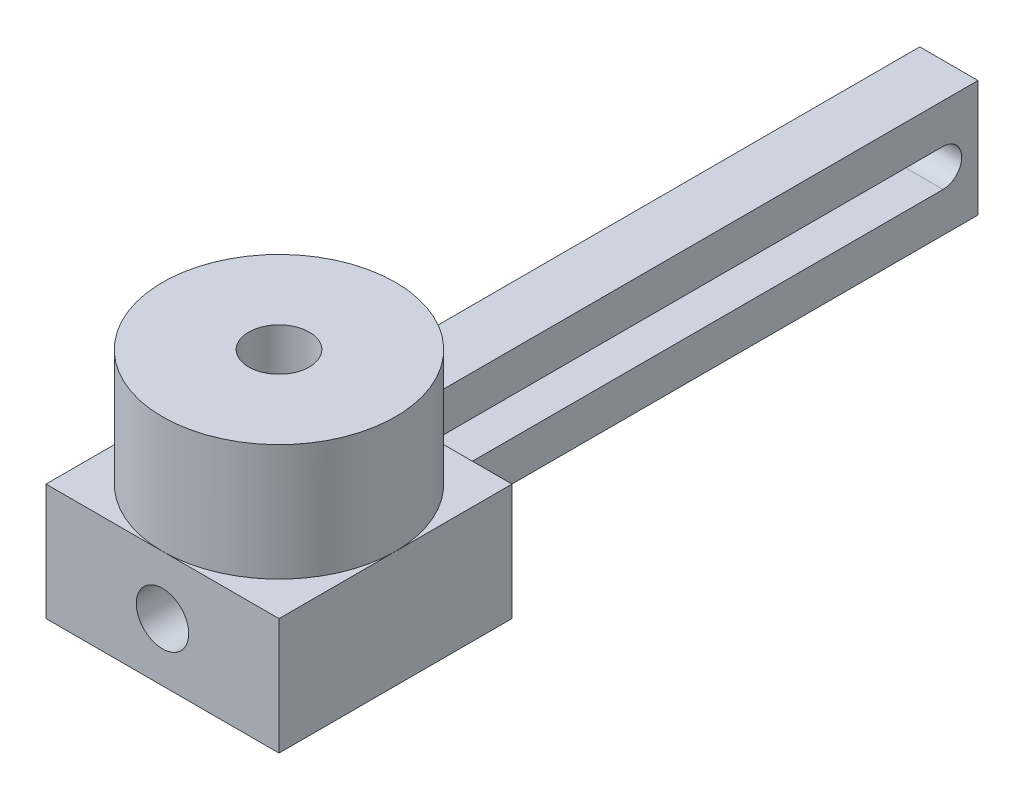
ISO-10303-21;
HEADER;
FILE_DESCRIPTION(('STEP AP214'),'2;1');
FILE_NAME('part.step','',(''),(''),'','','');
FILE_SCHEMA(('AUTOMOTIVE_DESIGN { 1 0 10303 214 1 1 1 1 }'));
ENDSEC;
DATA;
#1=APPLICATION_CONTEXT('core data for automotive mechanical design processes');
#2=APPLICATION_PROTOCOL_DEFINITION('international standard','automotive_design',2000,#1);
#3=PRODUCT_CONTEXT('',#1,'mechanical');
#4=PRODUCT('Part','Part','',(#3));
#5=PRODUCT_RELATED_PRODUCT_CATEGORY('part','',(#4));
#6=PRODUCT_DEFINITION_FORMATION('','',#4);
#7=PRODUCT_DEFINITION_CONTEXT('part definition',#1,'design');
#8=PRODUCT_DEFINITION('design','',#6,#7);
#9=PRODUCT_DEFINITION_SHAPE('','',#8);
#10=(LENGTH_UNIT() NAMED_UNIT(*) SI_UNIT(.MILLI.,.METRE.));
#11=(NAMED_UNIT(*) PLANE_ANGLE_UNIT() SI_UNIT($,.RADIAN.));
#12=(NAMED_UNIT(*) SI_UNIT($,.STERADIAN.) SOLID_ANGLE_UNIT());
#13=UNCERTAINTY_MEASURE_WITH_UNIT(LENGTH_MEASURE(1.E-05),#10,'distance_accuracy_value','');
#14=(GEOMETRIC_REPRESENTATION_CONTEXT(3) GLOBAL_UNCERTAINTY_ASSIGNED_CONTEXT((#13)) GLOBAL_UNIT_ASSIGNED_CONTEXT((#10,
#11,#12)) REPRESENTATION_CONTEXT('',''));
#15=CARTESIAN_POINT('',(0.,0.,0.));
#16=DIRECTION('',(0.,0.,1.));
#17=DIRECTION('',(1.,0.,0.));
#18=AXIS2_PLACEMENT_3D('',#15,#16,#17);
#19=CARTESIAN_POINT('',(-5.,10.,30.));
#20=DIRECTION('',(1.,0.,0.));
#21=DIRECTION('',(0.,0.,-1.));
#22=AXIS2_PLACEMENT_3D('',#19,#20,#21);
#23=PLANE('',#22);
#24=DIRECTION('',(0.,0.,1.));
#25=VECTOR('',#24,1.);
#26=CARTESIAN_POINT('',(-5.,3.4,-27.));
#27=LINE('',#26,#25);
#28=CARTESIAN_POINT('',(-5.,3.4,-27.));
#29=VERTEX_POINT('',#28);
#30=CARTESIAN_POINT('',(-5.,3.4,16.));
#31=VERTEX_POINT('',#30);
#32=EDGE_CURVE('E194',#29,#31,#27,.T.);
#33=ORIENTED_EDGE('',*,*,#32,.F.);
#34=CARTESIAN_POINT('',(-5.,5.,-27.));
#35=DIRECTION('',(-1.,0.,0.));
#36=DIRECTION('',(0.,0.,1.));
#37=AXIS2_PLACEMENT_3D('',#34,#35,#36);
#38=CIRCLE('',#37,1.6);
#39=CARTESIAN_POINT('',(-5.,6.6,-27.));
#40=VERTEX_POINT('',#39);
#41=EDGE_CURVE('E191',#40,#29,#38,.T.);
#42=ORIENTED_EDGE('',*,*,#41,.F.);
#43=DIRECTION('',(0.,0.,-1.));
#44=VECTOR('',#43,1.);
#45=CARTESIAN_POINT('',(-5.,6.6,-27.));
#46=LINE('',#45,#44);
#47=CARTESIAN_POINT('',(-5.,6.6,16.));
#48=VERTEX_POINT('',#47);
#49=EDGE_CURVE('E202',#48,#40,#46,.T.);
#50=ORIENTED_EDGE('',*,*,#49,.F.);
#51=CARTESIAN_POINT('',(-5.,5.,16.));
#52=DIRECTION('',(-1.,0.,0.));
#53=DIRECTION('',(0.,0.,1.));
#54=AXIS2_PLACEMENT_3D('',#51,#52,#53);
#55=CIRCLE('',#54,1.6);
#56=EDGE_CURVE('E198',#31,#48,#55,.T.);
#57=ORIENTED_EDGE('',*,*,#56,.F.);
#58=EDGE_LOOP('',(#33,#42,#50,#57));
#59=FACE_BOUND('',#58,.T.);
#60=DIRECTION('',(0.,-1.,0.));
#61=VECTOR('',#60,1.);
#62=CARTESIAN_POINT('',(-5.,10.,20.));
#63=LINE('',#62,#61);
#64=CARTESIAN_POINT('',(-5.,10.,20.));
#65=VERTEX_POINT('',#64);
#66=CARTESIAN_POINT('',(-5.,0.,20.));
#67=VERTEX_POINT('',#66);
#68=EDGE_CURVE('E63',#65,#67,#63,.T.);
#69=ORIENTED_EDGE('',*,*,#68,.F.);
#70=DIRECTION('',(0.,0.,1.));
#71=VECTOR('',#70,1.);
#72=CARTESIAN_POINT('',(-5.,10.,30.));
#73=LINE('',#72,#71);
#74=CARTESIAN_POINT('',(-5.,10.,-30.));
#75=VERTEX_POINT('',#74);
#76=EDGE_CURVE('E256',#75,#65,#73,.T.);
#77=ORIENTED_EDGE('',*,*,#76,.F.);
#78=DIRECTION('',(0.,-1.,0.));
#79=VECTOR('',#78,1.);
#80=CARTESIAN_POINT('',(-5.,10.,-30.));
#81=LINE('',#80,#79);
#82=CARTESIAN_POINT('',(-5.,0.,-30.));
#83=VERTEX_POINT('',#82);
#84=EDGE_CURVE('E259',#75,#83,#81,.T.);
#85=ORIENTED_EDGE('',*,*,#84,.T.);
#86=DIRECTION('',(0.,0.,1.));
#87=VECTOR('',#86,1.);
#88=CARTESIAN_POINT('',(-5.,0.,30.));
#89=LINE('',#88,#87);
#90=EDGE_CURVE('E68',#83,#67,#89,.T.);
#91=ORIENTED_EDGE('',*,*,#90,.T.);
#92=EDGE_LOOP('',(#69,#77,#85,#91));
#93=FACE_BOUND('',#92,.T.);
#94=ADVANCED_FACE('F47',(#59,#93),#23,.F.);
#95=CARTESIAN_POINT('',(0.,20.,30.));
#96=DIRECTION('',(0.,-1.,0.));
#97=DIRECTION('',(0.,0.,-1.));
#98=AXIS2_PLACEMENT_3D('',#95,#96,#97);
#99=CYLINDRICAL_SURFACE('',#98,10.);
#100=CARTESIAN_POINT('',(0.,20.,30.));
#101=DIRECTION('',(0.,1.,0.));
#102=DIRECTION('',(0.,0.,1.));
#103=AXIS2_PLACEMENT_3D('',#100,#101,#102);
#104=CIRCLE('',#103,10.);
#105=CARTESIAN_POINT('',(0.,20.,40.));
#106=VERTEX_POINT('',#105);
#107=EDGE_CURVE('E243',#106,#106,#104,.T.);
#108=ORIENTED_EDGE('',*,*,#107,.F.);
#109=EDGE_LOOP('',(#108));
#110=FACE_BOUND('',#109,.T.);
#111=CARTESIAN_POINT('',(0.,10.,30.));
#112=DIRECTION('',(0.,-1.,0.));
#113=DIRECTION('',(0.,0.,-1.));
#114=AXIS2_PLACEMENT_3D('',#111,#112,#113);
#115=CIRCLE('',#114,10.);
#116=CARTESIAN_POINT('',(10.,10.,30.));
#117=VERTEX_POINT('',#116);
#118=CARTESIAN_POINT('',(0.,10.,40.));
#119=VERTEX_POINT('',#118);
#120=EDGE_CURVE('E153',#117,#119,#115,.T.);
#121=ORIENTED_EDGE('',*,*,#120,.F.);
#122=CARTESIAN_POINT('',(0.,10.,30.));
#123=DIRECTION('',(0.,-1.,0.));
#124=DIRECTION('',(0.,0.,-1.));
#125=AXIS2_PLACEMENT_3D('',#122,#123,#124);
#126=CIRCLE('',#125,10.);
#127=CARTESIAN_POINT('',(0.,10.,20.));
#128=VERTEX_POINT('',#127);
#129=EDGE_CURVE('E248',#117,#128,#126,.F.);
#130=ORIENTED_EDGE('',*,*,#129,.T.);
#131=CARTESIAN_POINT('',(-10.,10.,30.));
#132=VERTEX_POINT('',#131);
#133=EDGE_CURVE('E247',#128,#132,#126,.F.);
#134=ORIENTED_EDGE('',*,*,#133,.T.);
#135=EDGE_CURVE('E182',#119,#132,#115,.T.);
#136=ORIENTED_EDGE('',*,*,#135,.F.);
#137=EDGE_LOOP('',(#121,#130,#134,#136));
#138=FACE_BOUND('',#137,.T.);
#139=ADVANCED_FACE('F306',(#110,#138),#99,.T.);
#140=CARTESIAN_POINT('',(0.,20.,30.));
#141=DIRECTION('',(0.,-1.,0.));
#142=DIRECTION('',(0.,0.,-1.));
#143=AXIS2_PLACEMENT_3D('',#140,#141,#142);
#144=CYLINDRICAL_SURFACE('',#143,2.6);
#145=CARTESIAN_POINT('',(2.25,5.,31.3028814220795));
#146=CARTESIAN_POINT('',(2.24999330145076,4.9258640802187,31.302900991512));
#147=CARTESIAN_POINT('',(2.24628899919312,4.85166665550486,31.3093535328206));
#148=CARTESIAN_POINT('',(2.23190199793571,4.70583402487835,31.3337138651166));
#149=CARTESIAN_POINT('',(2.22119898721934,4.63420691880781,31.3516549952422));
#150=CARTESIAN_POINT('',(2.18780906243965,4.46490921219136,31.4052918080339));
#151=CARTESIAN_POINT('',(2.1619476903597,4.36928845011578,31.4453049395887));
#152=CARTESIAN_POINT('',(2.09977706074741,4.18582314069619,31.5342423838016));
#153=CARTESIAN_POINT('',(2.06342838808052,4.09800959557704,31.5832000538734));
#154=CARTESIAN_POINT('',(1.99040791068232,3.94831050025853,31.6735800413865));
#155=CARTESIAN_POINT('',(1.9556288360965,3.88502040171271,31.7142367960842));
#156=CARTESIAN_POINT('',(1.88045299587418,3.76243285313603,31.796386538532));
#157=CARTESIAN_POINT('',(1.8400533508249,3.70313747285299,31.8378799455223));
#158=CARTESIAN_POINT('',(1.71054659546221,3.53129265691205,31.9616914290919));
#159=CARTESIAN_POINT('',(1.612991028934,3.42449777534571,32.0435257603755));
#160=CARTESIAN_POINT('',(1.41995919820945,3.25099845104683,32.1804645779456));
#161=CARTESIAN_POINT('',(1.32901194656057,3.18069138922072,32.2374262778764));
#162=CARTESIAN_POINT('',(1.13378784414384,3.05306149404458,32.3423791100754));
#163=CARTESIAN_POINT('',(1.02953374778608,2.99571694840681,32.3903852190796));
#164=CARTESIAN_POINT('',(0.829306545124255,2.90608760038453,32.4660721897017));
#165=CARTESIAN_POINT('',(0.735334978052761,2.87113384047658,32.4958672132049));
#166=CARTESIAN_POINT('',(0.541033533345685,2.8136739911043,32.5450536801225));
#167=CARTESIAN_POINT('',(0.440707465562096,2.7911605203271,32.5644512925246));
#168=CARTESIAN_POINT('',(0.235801630222388,2.75998169106086,32.5913547180046));
#169=CARTESIAN_POINT('',(0.13120322830646,2.75138559117428,32.5988010550032));
#170=CARTESIAN_POINT('',(-0.0782949057318882,2.74892545165571,32.6009297756695));
#171=CARTESIAN_POINT('',(-0.183194591876143,2.75505927223199,32.5956140132667));
#172=CARTESIAN_POINT('',(-0.381388303078068,2.78049075640434,32.573652173815));
#173=CARTESIAN_POINT('',(-0.474935702893244,2.79868603466576,32.5579551725509));
#174=CARTESIAN_POINT('',(-0.657083269572316,2.84602602438182,32.5173313266297));
#175=CARTESIAN_POINT('',(-0.745682586235334,2.87517261092911,32.4924029013706));
#176=CARTESIAN_POINT('',(-0.922620336570302,2.94549602958515,32.4327172511744));
#177=CARTESIAN_POINT('',(-1.0104724589549,2.98739286179203,32.3973776648439));
#178=CARTESIAN_POINT('',(-1.17775019547865,3.08047264962098,32.3197911520005));
#179=CARTESIAN_POINT('',(-1.257170167629,3.13166176145835,32.2775396481276));
#180=CARTESIAN_POINT('',(-1.44553451745539,3.27005388081044,32.1651337632809));
#181=CARTESIAN_POINT('',(-1.54888644405977,3.36231196363321,32.0917363958118));
#182=CARTESIAN_POINT('',(-1.68881646267614,3.5116862874541,31.9777640306926));
#183=CARTESIAN_POINT('',(-1.73300807052692,3.56340998748579,31.9390554232234));
#184=CARTESIAN_POINT('',(-1.81638680382284,3.67040201623991,31.8611808887389));
#185=CARTESIAN_POINT('',(-1.85557535817154,3.7256693260803,31.8220150958023));
#186=CARTESIAN_POINT('',(-1.95249631882825,3.87630899853231,31.719132002326));
#187=CARTESIAN_POINT('',(-2.00603860241903,3.97470475124525,31.6557493503667));
#188=CARTESIAN_POINT('',(-2.0757414040047,4.12994824203131,31.5661245868573));
#189=CARTESIAN_POINT('',(-2.0971913518885,4.18291526752366,31.537183635344));
#190=CARTESIAN_POINT('',(-2.13637340734276,4.29165711098877,31.4822417151527));
#191=CARTESIAN_POINT('',(-2.15410830169322,4.3474297851244,31.4562385495423));
#192=CARTESIAN_POINT('',(-2.18770720427863,4.46990173878021,31.4053438278301));
#193=CARTESIAN_POINT('',(-2.20297449691695,4.53704623289754,31.3811018459721));
#194=CARTESIAN_POINT('',(-2.22747426429568,4.67483964071041,31.3412360696769));
#195=CARTESIAN_POINT('',(-2.23672228084305,4.7454790184636,31.3255900967272));
#196=CARTESIAN_POINT('',(-2.24847605834555,4.88983479342612,31.3055686360162));
#197=CARTESIAN_POINT('',(-2.25090355868052,4.9635771298608,31.3013239946238));
#198=CARTESIAN_POINT('',(-2.24848517014633,5.11059212613225,31.3054941925056));
#199=CARTESIAN_POINT('',(-2.24363494158503,5.18386447954921,31.3139165851085));
#200=CARTESIAN_POINT('',(-2.22594418794106,5.3386241774601,31.3436882640333));
#201=CARTESIAN_POINT('',(-2.21197697196194,5.41961387854789,31.3668463794876));
#202=CARTESIAN_POINT('',(-2.17638781845319,5.57650597708427,31.4228228425471));
#203=CARTESIAN_POINT('',(-2.15473768749295,5.65238839593493,31.4556766941001));
#204=CARTESIAN_POINT('',(-2.10842428953527,5.7882989140396,31.5218202666096));
#205=CARTESIAN_POINT('',(-2.08466351111483,5.84902350658826,31.5543448812235));
#206=CARTESIAN_POINT('',(-2.03258858877001,5.96708088162643,31.6218533448842));
#207=CARTESIAN_POINT('',(-2.00427133226337,6.02441130863812,31.6568388657429));
#208=CARTESIAN_POINT('',(-1.91268474165804,6.19178937437806,31.7636311946083));
#209=CARTESIAN_POINT('',(-1.84280671714632,6.29714918030954,31.8372338303761));
#210=CARTESIAN_POINT('',(-1.68085933916187,6.50175002599741,31.9868778533615));
#211=CARTESIAN_POINT('',(-1.58768606993855,6.60021141722907,32.0627891572802));
#212=CARTESIAN_POINT('',(-1.38154063735695,6.78116304304481,32.2061326156968));
#213=CARTESIAN_POINT('',(-1.26862098866731,6.86369444769498,32.2735864652722));
#214=CARTESIAN_POINT('',(-1.05860241987063,6.98801671529506,32.3767395471279));
#215=CARTESIAN_POINT('',(-0.966165898533776,7.03471509614192,32.4160099880405));
#216=CARTESIAN_POINT('',(-0.772566413003492,7.11580414614525,32.4846848591754));
#217=CARTESIAN_POINT('',(-0.671409151002115,7.15020278305517,32.5140956756719));
#218=CARTESIAN_POINT('',(-0.461717791439902,7.20479707940461,32.5609436138678));
#219=CARTESIAN_POINT('',(-0.353132962894019,7.22488152128765,32.5782869502783));
#220=CARTESIAN_POINT('',(-0.132881580363164,7.24879592591336,32.5989507210698));
#221=CARTESIAN_POINT('',(-0.0212171320132093,7.2526367305912,32.6022805088896));
#222=CARTESIAN_POINT('',(0.187649248540151,7.24430320402878,32.5950714979961));
#223=CARTESIAN_POINT('',(0.284990460031568,7.23398088232947,32.5861364257693));
#224=CARTESIAN_POINT('',(0.476026283556189,7.20120271215055,32.5578749969421));
#225=CARTESIAN_POINT('',(0.569720449163928,7.17874538323187,32.5385473724789));
#226=CARTESIAN_POINT('',(0.752531391952896,7.12260927741629,32.4905332472295));
#227=CARTESIAN_POINT('',(0.84157136283304,7.08878620068853,32.4617265022575));
#228=CARTESIAN_POINT('',(1.01237970725114,7.01156322846355,32.3965515302745));
#229=CARTESIAN_POINT('',(1.09414512780422,6.9681594685069,32.3601802523803));
#230=CARTESIAN_POINT('',(1.28627967955924,6.85092555984832,32.263156779711));
#231=CARTESIAN_POINT('',(1.39206445535752,6.77237562844299,32.1991200221702));
#232=CARTESIAN_POINT('',(1.5861768266682,6.60106168333753,32.0635175424234));
#233=CARTESIAN_POINT('',(1.67445261239869,6.50825688536808,31.9919304082256));
#234=CARTESIAN_POINT('',(1.79450950990334,6.35882989675406,31.8822231316237));
#235=CARTESIAN_POINT('',(1.832795319716,6.30672902861856,31.8448710467607));
#236=CARTESIAN_POINT('',(1.90481602765919,6.19931594624029,31.7704106051414));
#237=CARTESIAN_POINT('',(1.93855246063371,6.1440048241092,31.7333021702237));
#238=CARTESIAN_POINT('',(2.00138270448196,6.03014119189817,31.660355282121));
#239=CARTESIAN_POINT('',(2.03048321867079,5.97159352989884,31.6245150546302));
#240=CARTESIAN_POINT('',(2.08391416827877,5.85096899406763,31.5553802524678));
#241=CARTESIAN_POINT('',(2.10824851001542,5.78889506462758,31.5220836068661));
#242=CARTESIAN_POINT('',(2.15366898476491,5.65543628855317,31.4571895448017));
#243=CARTESIAN_POINT('',(2.17430773896313,5.58370775765185,31.4259726155472));
#244=CARTESIAN_POINT('',(2.20872125366922,5.43563376734781,31.3720725524195));
#245=CARTESIAN_POINT('',(2.22252047932126,5.35930587549504,31.3493590739302));
#246=CARTESIAN_POINT('',(2.23815441225325,5.23519107112605,31.3231754522153));
#247=CARTESIAN_POINT('',(2.24257593172129,5.18858809744862,31.3156327405979));
#248=CARTESIAN_POINT('',(2.24850051878828,5.0946649955423,31.305480061126));
#249=CARTESIAN_POINT('',(2.25000427785994,5.04734503990885,31.3028689245539));
#250=CARTESIAN_POINT('',(2.25,5.,31.3028814220795));
#251=B_SPLINE_CURVE_WITH_KNOTS('',3,(#145,#146,#147,#148,#149,#150,#151,#152,#153,#154,#155,
#156,#157,#158,#159,#160,#161,#162,#163,#164,#165,#166,#167,#168,#169,#170,#171,#172,#173,#174,
#175,#176,#177,#178,#179,#180,#181,#182,#183,#184,#185,#186,#187,#188,#189,#190,#191,#192,#193,
#194,#195,#196,#197,#198,#199,#200,#201,#202,#203,#204,#205,#206,#207,#208,#209,#210,#211,#212,
#213,#214,#215,#216,#217,#218,#219,#220,#221,#222,#223,#224,#225,#226,#227,#228,#229,#230,#231,
#232,#233,#234,#235,#236,#237,#238,#239,#240,#241,#242,#243,#244,#245,#246,#247,#248,#249,#250),
.UNSPECIFIED.,.T.,.F.,(4,2,2,2,2,2,2,2,2,2,2,2,2,2,2,2,2,2,2,2,2,2,2,2,2,2,2,2,2,2,2,2,2,2,2,2,
2,2,2,2,2,2,2,2,2,2,2,2,2,2,2,2,4),(0.,0.222194483433209,0.445036701039096,0.763730453352175,
1.0836379344537,1.33195325285354,1.58039625461989,2.0761874328192,2.4597389697845,
2.84264321501054,3.15514892155454,3.46746900652091,3.78133860080087,4.09516260251075,
4.38365841849669,4.67220365351738,4.98170574443689,5.29141363651091,5.7590290098714,
5.99366645174007,6.22823672904278,6.61298061111761,6.80497566206601,6.996826171552,
7.21517444551572,7.43295668259977,7.65322780837113,7.87363033348996,8.12835576804483,
8.38402578395061,8.60233850114488,8.82080098836089,9.25798883063243,9.72217464897674,
10.1851442550035,10.5161731699684,10.8469872547906,11.1803444569092,11.5134791221605,
11.8069575699553,12.1004718294372,12.397862953824,12.6953742536579,13.13250672272,
13.570913994625,13.7947551676366,14.0185206323808,14.2419595473039,14.4652145600154,
14.7073088879061,14.9485308742559,15.0904634310384,15.2323623474706),.UNSPECIFIED.);
#252=CARTESIAN_POINT('',(2.25,5.,31.3028814220795));
#253=VERTEX_POINT('',#252);
#254=EDGE_CURVE('E333',#253,#253,#251,.T.);
#255=ORIENTED_EDGE('',*,*,#254,.F.);
#256=EDGE_LOOP('',(#255));
#257=FACE_BOUND('',#256,.T.);
#258=CARTESIAN_POINT('',(0.,20.,30.));
#259=DIRECTION('',(0.,1.,0.));
#260=DIRECTION('',(0.,0.,1.));
#261=AXIS2_PLACEMENT_3D('',#258,#259,#260);
#262=CIRCLE('',#261,2.6);
#263=CARTESIAN_POINT('',(0.,20.,32.6));
#264=VERTEX_POINT('',#263);
#265=EDGE_CURVE('E237',#264,#264,#262,.T.);
#266=ORIENTED_EDGE('',*,*,#265,.T.);
#267=EDGE_LOOP('',(#266));
#268=FACE_BOUND('',#267,.T.);
#269=CARTESIAN_POINT('',(0.,0.,30.));
#270=DIRECTION('',(0.,-1.,0.));
#271=DIRECTION('',(0.,0.,-1.));
#272=AXIS2_PLACEMENT_3D('',#269,#270,#271);
#273=CIRCLE('',#272,2.6);
#274=CARTESIAN_POINT('',(0.,0.,27.4));
#275=VERTEX_POINT('',#274);
#276=EDGE_CURVE('E342',#275,#275,#273,.T.);
#277=ORIENTED_EDGE('',*,*,#276,.T.);
#278=EDGE_LOOP('',(#277));
#279=FACE_BOUND('',#278,.T.);
#280=ADVANCED_FACE('F309',(#257,#268,#279),#144,.F.);
#281=CARTESIAN_POINT('',(0.,10.,0.));
#282=DIRECTION('',(0.,-1.,0.));
#283=DIRECTION('',(0.,0.,-1.));
#284=AXIS2_PLACEMENT_3D('',#281,#282,#283);
#285=PLANE('',#284);
#286=ORIENTED_EDGE('',*,*,#133,.F.);
#287=DIRECTION('',(0.,0.,1.));
#288=VECTOR('',#287,1.);
#289=CARTESIAN_POINT('',(0.,10.,-30.));
#290=LINE('',#289,#288);
#291=CARTESIAN_POINT('',(0.,10.,-30.));
#292=VERTEX_POINT('',#291);
#293=EDGE_CURVE('E210',#292,#128,#290,.T.);
#294=ORIENTED_EDGE('',*,*,#293,.F.);
#295=DIRECTION('',(-1.,0.,0.));
#296=VECTOR('',#295,1.);
#297=CARTESIAN_POINT('',(-5.,10.,-30.));
#298=LINE('',#297,#296);
#299=EDGE_CURVE('E253',#292,#75,#298,.T.);
#300=ORIENTED_EDGE('',*,*,#299,.T.);
#301=ORIENTED_EDGE('',*,*,#76,.T.);
#302=DIRECTION('',(-1.,0.,0.));
#303=VECTOR('',#302,1.);
#304=CARTESIAN_POINT('',(-10.,10.,20.));
#305=LINE('',#304,#303);
#306=CARTESIAN_POINT('',(-10.,10.,20.));
#307=VERTEX_POINT('',#306);
#308=EDGE_CURVE('E387',#65,#307,#305,.T.);
#309=ORIENTED_EDGE('',*,*,#308,.T.);
#310=DIRECTION('',(0.,0.,-1.));
#311=VECTOR('',#310,1.);
#312=CARTESIAN_POINT('',(-10.,10.,40.));
#313=LINE('',#312,#311);
#314=EDGE_CURVE('E406',#132,#307,#313,.T.);
#315=ORIENTED_EDGE('',*,*,#314,.F.);
#316=EDGE_LOOP('',(#286,#294,#300,#301,#309,#315));
#317=FACE_BOUND('',#316,.T.);
#318=ADVANCED_FACE('F321',(#317),#285,.F.);
#319=CARTESIAN_POINT('',(-5.,10.,-30.));
#320=DIRECTION('',(0.,0.,1.));
#321=DIRECTION('',(1.,0.,0.));
#322=AXIS2_PLACEMENT_3D('',#319,#320,#321);
#323=PLANE('',#322);
#324=ORIENTED_EDGE('',*,*,#299,.F.);
#325=DIRECTION('',(0.,1.,0.));
#326=VECTOR('',#325,1.);
#327=CARTESIAN_POINT('',(0.,0.,-30.));
#328=LINE('',#327,#326);
#329=CARTESIAN_POINT('',(0.,0.,-30.));
#330=VERTEX_POINT('',#329);
#331=EDGE_CURVE('E234',#330,#292,#328,.T.);
#332=ORIENTED_EDGE('',*,*,#331,.F.);
#333=DIRECTION('',(-1.,0.,0.));
#334=VECTOR('',#333,1.);
#335=CARTESIAN_POINT('',(-5.,0.,-30.));
#336=LINE('',#335,#334);
#337=EDGE_CURVE('E252',#330,#83,#336,.T.);
#338=ORIENTED_EDGE('',*,*,#337,.T.);
#339=ORIENTED_EDGE('',*,*,#84,.F.);
#340=EDGE_LOOP('',(#324,#332,#338,#339));
#341=FACE_BOUND('',#340,.T.);
#342=ADVANCED_FACE('F49',(#341),#323,.F.);
#343=ORIENTED_EDGE('',*,*,#129,.F.);
#344=DIRECTION('',(0.,0.,-1.));
#345=VECTOR('',#344,1.);
#346=CARTESIAN_POINT('',(10.,10.,40.));
#347=LINE('',#346,#345);
#348=CARTESIAN_POINT('',(10.,10.,20.));
#349=VERTEX_POINT('',#348);
#350=EDGE_CURVE('E176',#117,#349,#347,.T.);
#351=ORIENTED_EDGE('',*,*,#350,.T.);
#352=DIRECTION('',(1.,0.,0.));
#353=VECTOR('',#352,1.);
#354=CARTESIAN_POINT('',(0.,10.,20.));
#355=LINE('',#354,#353);
#356=EDGE_CURVE('E225',#128,#349,#355,.T.);
#357=ORIENTED_EDGE('',*,*,#356,.F.);
#358=EDGE_LOOP('',(#343,#351,#357));
#359=FACE_BOUND('',#358,.T.);
#360=ADVANCED_FACE('F317',(#359),#285,.F.);
#361=CARTESIAN_POINT('',(0.,0.,0.));
#362=DIRECTION('',(0.,-1.,0.));
#363=DIRECTION('',(0.,0.,-1.));
#364=AXIS2_PLACEMENT_3D('',#361,#362,#363);
#365=PLANE('',#364);
#366=ORIENTED_EDGE('',*,*,#276,.F.);
#367=EDGE_LOOP('',(#366));
#368=FACE_BOUND('',#367,.T.);
#369=DIRECTION('',(1.,0.,0.));
#370=VECTOR('',#369,1.);
#371=CARTESIAN_POINT('',(0.,0.,20.));
#372=LINE('',#371,#370);
#373=CARTESIAN_POINT('',(0.,0.,20.));
#374=VERTEX_POINT('',#373);
#375=CARTESIAN_POINT('',(10.,0.,20.));
#376=VERTEX_POINT('',#375);
#377=EDGE_CURVE('E224',#374,#376,#372,.T.);
#378=ORIENTED_EDGE('',*,*,#377,.T.);
#379=DIRECTION('',(0.,0.,-1.));
#380=VECTOR('',#379,1.);
#381=CARTESIAN_POINT('',(10.,0.,40.));
#382=LINE('',#381,#380);
#383=CARTESIAN_POINT('',(10.,0.,40.));
#384=VERTEX_POINT('',#383);
#385=EDGE_CURVE('E386',#384,#376,#382,.T.);
#386=ORIENTED_EDGE('',*,*,#385,.F.);
#387=DIRECTION('',(1.,0.,0.));
#388=VECTOR('',#387,1.);
#389=CARTESIAN_POINT('',(-10.,0.,40.));
#390=LINE('',#389,#388);
#391=CARTESIAN_POINT('',(-10.,0.,40.));
#392=VERTEX_POINT('',#391);
#393=EDGE_CURVE('E166',#392,#384,#390,.T.);
#394=ORIENTED_EDGE('',*,*,#393,.F.);
#395=DIRECTION('',(0.,0.,-1.));
#396=VECTOR('',#395,1.);
#397=CARTESIAN_POINT('',(-10.,0.,40.));
#398=LINE('',#397,#396);
#399=CARTESIAN_POINT('',(-10.,0.,20.));
#400=VERTEX_POINT('',#399);
#401=EDGE_CURVE('E404',#392,#400,#398,.T.);
#402=ORIENTED_EDGE('',*,*,#401,.T.);
#403=DIRECTION('',(1.,0.,0.));
#404=VECTOR('',#403,1.);
#405=CARTESIAN_POINT('',(-10.,0.,20.));
#406=LINE('',#405,#404);
#407=EDGE_CURVE('E170',#400,#67,#406,.T.);
#408=ORIENTED_EDGE('',*,*,#407,.T.);
#409=ORIENTED_EDGE('',*,*,#90,.F.);
#410=ORIENTED_EDGE('',*,*,#337,.F.);
#411=DIRECTION('',(0.,0.,1.));
#412=VECTOR('',#411,1.);
#413=CARTESIAN_POINT('',(0.,0.,-30.));
#414=LINE('',#413,#412);
#415=EDGE_CURVE('E220',#330,#374,#414,.T.);
#416=ORIENTED_EDGE('',*,*,#415,.T.);
#417=EDGE_LOOP('',(#378,#386,#394,#402,#408,#409,#410,#416));
#418=FACE_BOUND('',#417,.T.);
#419=ADVANCED_FACE('F313',(#368,#418),#365,.T.);
#420=CARTESIAN_POINT('',(0.,20.,30.));
#421=DIRECTION('',(0.,1.,0.));
#422=DIRECTION('',(0.,0.,1.));
#423=AXIS2_PLACEMENT_3D('',#420,#421,#422);
#424=PLANE('',#423);
#425=ORIENTED_EDGE('',*,*,#107,.T.);
#426=EDGE_LOOP('',(#425));
#427=FACE_BOUND('',#426,.T.);
#428=ORIENTED_EDGE('',*,*,#265,.F.);
#429=EDGE_LOOP('',(#428));
#430=FACE_BOUND('',#429,.T.);
#431=ADVANCED_FACE('F316',(#427,#430),#424,.T.);
#432=CARTESIAN_POINT('',(0.,0.,20.));
#433=DIRECTION('',(0.,0.,1.));
#434=DIRECTION('',(1.,0.,0.));
#435=AXIS2_PLACEMENT_3D('',#432,#433,#434);
#436=PLANE('',#435);
#437=ORIENTED_EDGE('',*,*,#377,.F.);
#438=DIRECTION('',(0.,1.,0.));
#439=VECTOR('',#438,1.);
#440=CARTESIAN_POINT('',(0.,0.,20.));
#441=LINE('',#440,#439);
#442=EDGE_CURVE('E228',#374,#128,#441,.T.);
#443=ORIENTED_EDGE('',*,*,#442,.T.);
#444=ORIENTED_EDGE('',*,*,#356,.T.);
#445=DIRECTION('',(0.,1.,0.));
#446=VECTOR('',#445,1.);
#447=CARTESIAN_POINT('',(10.,10.,20.));
#448=LINE('',#447,#446);
#449=EDGE_CURVE('E372',#376,#349,#448,.T.);
#450=ORIENTED_EDGE('',*,*,#449,.F.);
#451=EDGE_LOOP('',(#437,#443,#444,#450));
#452=FACE_BOUND('',#451,.T.);
#453=ADVANCED_FACE('F325',(#452),#436,.F.);
#454=CARTESIAN_POINT('',(0.,0.,-30.));
#455=DIRECTION('',(-1.,0.,0.));
#456=DIRECTION('',(0.,0.,1.));
#457=AXIS2_PLACEMENT_3D('',#454,#455,#456);
#458=PLANE('',#457);
#459=DIRECTION('',(0.,0.,-1.));
#460=VECTOR('',#459,1.);
#461=CARTESIAN_POINT('',(0.,6.6,-30.));
#462=LINE('',#461,#460);
#463=CARTESIAN_POINT('',(0.,6.6,16.));
#464=VERTEX_POINT('',#463);
#465=CARTESIAN_POINT('',(0.,6.6,-27.));
#466=VERTEX_POINT('',#465);
#467=EDGE_CURVE('E56',#464,#466,#462,.T.);
#468=ORIENTED_EDGE('',*,*,#467,.T.);
#469=CARTESIAN_POINT('',(0.,5.,-27.));
#470=DIRECTION('',(-1.,0.,0.));
#471=DIRECTION('',(0.,0.,1.));
#472=AXIS2_PLACEMENT_3D('',#469,#470,#471);
#473=CIRCLE('',#472,1.6);
#474=CARTESIAN_POINT('',(0.,3.4,-27.));
#475=VERTEX_POINT('',#474);
#476=EDGE_CURVE('E11',#466,#475,#473,.T.);
#477=ORIENTED_EDGE('',*,*,#476,.T.);
#478=DIRECTION('',(0.,0.,1.));
#479=VECTOR('',#478,1.);
#480=CARTESIAN_POINT('',(0.,3.4,-30.));
#481=LINE('',#480,#479);
#482=CARTESIAN_POINT('',(0.,3.4,16.));
#483=VERTEX_POINT('',#482);
#484=EDGE_CURVE('E266',#475,#483,#481,.T.);
#485=ORIENTED_EDGE('',*,*,#484,.T.);
#486=CARTESIAN_POINT('',(0.,5.,16.));
#487=DIRECTION('',(-1.,0.,0.));
#488=DIRECTION('',(0.,0.,1.));
#489=AXIS2_PLACEMENT_3D('',#486,#487,#488);
#490=CIRCLE('',#489,1.6);
#491=EDGE_CURVE('E270',#483,#464,#490,.T.);
#492=ORIENTED_EDGE('',*,*,#491,.T.);
#493=EDGE_LOOP('',(#468,#477,#485,#492));
#494=FACE_BOUND('',#493,.T.);
#495=ORIENTED_EDGE('',*,*,#293,.T.);
#496=ORIENTED_EDGE('',*,*,#442,.F.);
#497=ORIENTED_EDGE('',*,*,#415,.F.);
#498=ORIENTED_EDGE('',*,*,#331,.T.);
#499=EDGE_LOOP('',(#495,#496,#497,#498));
#500=FACE_BOUND('',#499,.T.);
#501=ADVANCED_FACE('F277',(#494,#500),#458,.F.);
#502=CARTESIAN_POINT('',(10.,5.,-27.));
#503=DIRECTION('',(-1.,0.,0.));
#504=DIRECTION('',(0.,0.,1.));
#505=AXIS2_PLACEMENT_3D('',#502,#503,#504);
#506=CYLINDRICAL_SURFACE('',#505,1.6);
#507=DIRECTION('',(-1.,0.,0.));
#508=VECTOR('',#507,1.);
#509=CARTESIAN_POINT('',(10.,6.6,-27.));
#510=LINE('',#509,#508);
#511=EDGE_CURVE('E207',#466,#40,#510,.T.);
#512=ORIENTED_EDGE('',*,*,#511,.T.);
#513=ORIENTED_EDGE('',*,*,#41,.T.);
#514=DIRECTION('',(-1.,0.,0.));
#515=VECTOR('',#514,1.);
#516=CARTESIAN_POINT('',(10.,3.4,-27.));
#517=LINE('',#516,#515);
#518=EDGE_CURVE('E206',#475,#29,#517,.T.);
#519=ORIENTED_EDGE('',*,*,#518,.F.);
#520=ORIENTED_EDGE('',*,*,#476,.F.);
#521=EDGE_LOOP('',(#512,#513,#519,#520));
#522=FACE_BOUND('',#521,.T.);
#523=ADVANCED_FACE('F293',(#522),#506,.F.);
#524=CARTESIAN_POINT('',(10.,6.6,-27.));
#525=DIRECTION('',(0.,1.,0.));
#526=DIRECTION('',(0.,0.,1.));
#527=AXIS2_PLACEMENT_3D('',#524,#525,#526);
#528=PLANE('',#527);
#529=DIRECTION('',(-1.,0.,0.));
#530=VECTOR('',#529,1.);
#531=CARTESIAN_POINT('',(10.,6.6,16.));
#532=LINE('',#531,#530);
#533=EDGE_CURVE('E211',#464,#48,#532,.T.);
#534=ORIENTED_EDGE('',*,*,#533,.T.);
#535=ORIENTED_EDGE('',*,*,#49,.T.);
#536=ORIENTED_EDGE('',*,*,#511,.F.);
#537=ORIENTED_EDGE('',*,*,#467,.F.);
#538=EDGE_LOOP('',(#534,#535,#536,#537));
#539=FACE_BOUND('',#538,.T.);
#540=ADVANCED_FACE('F283',(#539),#528,.F.);
#541=CARTESIAN_POINT('',(10.,5.,16.));
#542=DIRECTION('',(-1.,0.,0.));
#543=DIRECTION('',(0.,0.,1.));
#544=AXIS2_PLACEMENT_3D('',#541,#542,#543);
#545=CYLINDRICAL_SURFACE('',#544,1.6);
#546=DIRECTION('',(-1.,0.,0.));
#547=VECTOR('',#546,1.);
#548=CARTESIAN_POINT('',(10.,3.4,16.));
#549=LINE('',#548,#547);
#550=EDGE_CURVE('E214',#483,#31,#549,.T.);
#551=ORIENTED_EDGE('',*,*,#550,.T.);
#552=ORIENTED_EDGE('',*,*,#56,.T.);
#553=ORIENTED_EDGE('',*,*,#533,.F.);
#554=ORIENTED_EDGE('',*,*,#491,.F.);
#555=EDGE_LOOP('',(#551,#552,#553,#554));
#556=FACE_BOUND('',#555,.T.);
#557=ADVANCED_FACE('F285',(#556),#545,.F.);
#558=CARTESIAN_POINT('',(10.,3.4,-27.));
#559=DIRECTION('',(0.,-1.,0.));
#560=DIRECTION('',(0.,0.,-1.));
#561=AXIS2_PLACEMENT_3D('',#558,#559,#560);
#562=PLANE('',#561);
#563=ORIENTED_EDGE('',*,*,#518,.T.);
#564=ORIENTED_EDGE('',*,*,#32,.T.);
#565=ORIENTED_EDGE('',*,*,#550,.F.);
#566=ORIENTED_EDGE('',*,*,#484,.F.);
#567=EDGE_LOOP('',(#563,#564,#565,#566));
#568=FACE_BOUND('',#567,.T.);
#569=ADVANCED_FACE('F295',(#568),#562,.F.);
#570=CARTESIAN_POINT('',(10.,10.,40.));
#571=DIRECTION('',(-1.,0.,0.));
#572=DIRECTION('',(0.,-1.,0.));
#573=AXIS2_PLACEMENT_3D('',#570,#571,#572);
#574=PLANE('',#573);
#575=ORIENTED_EDGE('',*,*,#350,.F.);
#576=CARTESIAN_POINT('',(10.,10.,40.));
#577=VERTEX_POINT('',#576);
#578=EDGE_CURVE('E151',#577,#117,#347,.T.);
#579=ORIENTED_EDGE('',*,*,#578,.F.);
#580=DIRECTION('',(0.,1.,0.));
#581=VECTOR('',#580,1.);
#582=CARTESIAN_POINT('',(10.,10.,40.));
#583=LINE('',#582,#581);
#584=EDGE_CURVE('E162',#384,#577,#583,.T.);
#585=ORIENTED_EDGE('',*,*,#584,.F.);
#586=ORIENTED_EDGE('',*,*,#385,.T.);
#587=ORIENTED_EDGE('',*,*,#449,.T.);
#588=EDGE_LOOP('',(#575,#579,#585,#586,#587));
#589=FACE_BOUND('',#588,.T.);
#590=ADVANCED_FACE('F173',(#589),#574,.F.);
#591=CARTESIAN_POINT('',(-10.,10.,40.));
#592=DIRECTION('',(1.,0.,0.));
#593=DIRECTION('',(0.,0.,-1.));
#594=AXIS2_PLACEMENT_3D('',#591,#592,#593);
#595=PLANE('',#594);
#596=CARTESIAN_POINT('',(-10.,10.,40.));
#597=VERTEX_POINT('',#596);
#598=EDGE_CURVE('E185',#597,#132,#313,.T.);
#599=ORIENTED_EDGE('',*,*,#598,.T.);
#600=ORIENTED_EDGE('',*,*,#314,.T.);
#601=DIRECTION('',(0.,-1.,0.));
#602=VECTOR('',#601,1.);
#603=CARTESIAN_POINT('',(-10.,10.,20.));
#604=LINE('',#603,#602);
#605=EDGE_CURVE('E390',#307,#400,#604,.T.);
#606=ORIENTED_EDGE('',*,*,#605,.T.);
#607=ORIENTED_EDGE('',*,*,#401,.F.);
#608=DIRECTION('',(0.,-1.,0.));
#609=VECTOR('',#608,1.);
#610=CARTESIAN_POINT('',(-10.,10.,40.));
#611=LINE('',#610,#609);
#612=EDGE_CURVE('E157',#597,#392,#611,.T.);
#613=ORIENTED_EDGE('',*,*,#612,.F.);
#614=EDGE_LOOP('',(#599,#600,#606,#607,#613));
#615=FACE_BOUND('',#614,.T.);
#616=ADVANCED_FACE('F301',(#615),#595,.F.);
#617=CARTESIAN_POINT('',(0.,0.,40.));
#618=DIRECTION('',(0.,0.,1.));
#619=DIRECTION('',(1.,0.,0.));
#620=AXIS2_PLACEMENT_3D('',#617,#618,#619);
#621=PLANE('',#620);
#622=CARTESIAN_POINT('',(0.,5.,40.));
#623=DIRECTION('',(0.,0.,1.));
#624=DIRECTION('',(1.,0.,0.));
#625=AXIS2_PLACEMENT_3D('',#622,#623,#624);
#626=CIRCLE('',#625,2.25);
#627=CARTESIAN_POINT('',(2.25,5.,40.));
#628=VERTEX_POINT('',#627);
#629=EDGE_CURVE('E343',#628,#628,#626,.T.);
#630=ORIENTED_EDGE('',*,*,#629,.F.);
#631=EDGE_LOOP('',(#630));
#632=FACE_BOUND('',#631,.T.);
#633=ORIENTED_EDGE('',*,*,#393,.T.);
#634=ORIENTED_EDGE('',*,*,#584,.T.);
#635=DIRECTION('',(-1.,0.,0.));
#636=VECTOR('',#635,1.);
#637=CARTESIAN_POINT('',(-10.,10.,40.));
#638=LINE('',#637,#636);
#639=EDGE_CURVE('E147',#577,#119,#638,.T.);
#640=ORIENTED_EDGE('',*,*,#639,.T.);
#641=EDGE_CURVE('E158',#119,#597,#638,.T.);
#642=ORIENTED_EDGE('',*,*,#641,.T.);
#643=ORIENTED_EDGE('',*,*,#612,.T.);
#644=EDGE_LOOP('',(#633,#634,#640,#642,#643));
#645=FACE_BOUND('',#644,.T.);
#646=ADVANCED_FACE('F163',(#632,#645),#621,.T.);
#647=CARTESIAN_POINT('',(-10.,10.,40.));
#648=DIRECTION('',(0.,-1.,0.));
#649=DIRECTION('',(0.,0.,-1.));
#650=AXIS2_PLACEMENT_3D('',#647,#648,#649);
#651=PLANE('',#650);
#652=ORIENTED_EDGE('',*,*,#578,.T.);
#653=ORIENTED_EDGE('',*,*,#120,.T.);
#654=ORIENTED_EDGE('',*,*,#639,.F.);
#655=EDGE_LOOP('',(#652,#653,#654));
#656=FACE_BOUND('',#655,.T.);
#657=ADVANCED_FACE('F149',(#656),#651,.F.);
#658=ORIENTED_EDGE('',*,*,#641,.F.);
#659=ORIENTED_EDGE('',*,*,#135,.T.);
#660=ORIENTED_EDGE('',*,*,#598,.F.);
#661=EDGE_LOOP('',(#658,#659,#660));
#662=FACE_BOUND('',#661,.T.);
#663=ADVANCED_FACE('F355',(#662),#651,.F.);
#664=CARTESIAN_POINT('',(0.,0.,20.));
#665=DIRECTION('',(0.,0.,1.));
#666=DIRECTION('',(1.,0.,0.));
#667=AXIS2_PLACEMENT_3D('',#664,#665,#666);
#668=PLANE('',#667);
#669=ORIENTED_EDGE('',*,*,#308,.F.);
#670=ORIENTED_EDGE('',*,*,#68,.T.);
#671=ORIENTED_EDGE('',*,*,#407,.F.);
#672=ORIENTED_EDGE('',*,*,#605,.F.);
#673=EDGE_LOOP('',(#669,#670,#671,#672));
#674=FACE_BOUND('',#673,.T.);
#675=ADVANCED_FACE('F348',(#674),#668,.F.);
#676=CARTESIAN_POINT('',(0.,5.,30.));
#677=DIRECTION('',(0.,0.,1.));
#678=DIRECTION('',(1.,0.,0.));
#679=AXIS2_PLACEMENT_3D('',#676,#677,#678);
#680=CYLINDRICAL_SURFACE('',#679,2.25);
#681=ORIENTED_EDGE('',*,*,#254,.T.);
#682=EDGE_LOOP('',(#681));
#683=FACE_BOUND('',#682,.T.);
#684=ORIENTED_EDGE('',*,*,#629,.T.);
#685=EDGE_LOOP('',(#684));
#686=FACE_BOUND('',#685,.T.);
#687=ADVANCED_FACE('F344',(#683,#686),#680,.F.);
#688=CLOSED_SHELL('',(#94,#139,#280,#318,#342,#360,#419,#431,#453,#501,#523,#540,#557,#569,#590,
#616,#646,#657,#663,#675,#687));
#689=MANIFOLD_SOLID_BREP('B2',#688);
#690=ADVANCED_BREP_SHAPE_REPRESENTATION('',(#18,#689),#14);
#691=SHAPE_DEFINITION_REPRESENTATION(#9,#690);
ENDSEC;
END-ISO-10303-21;
